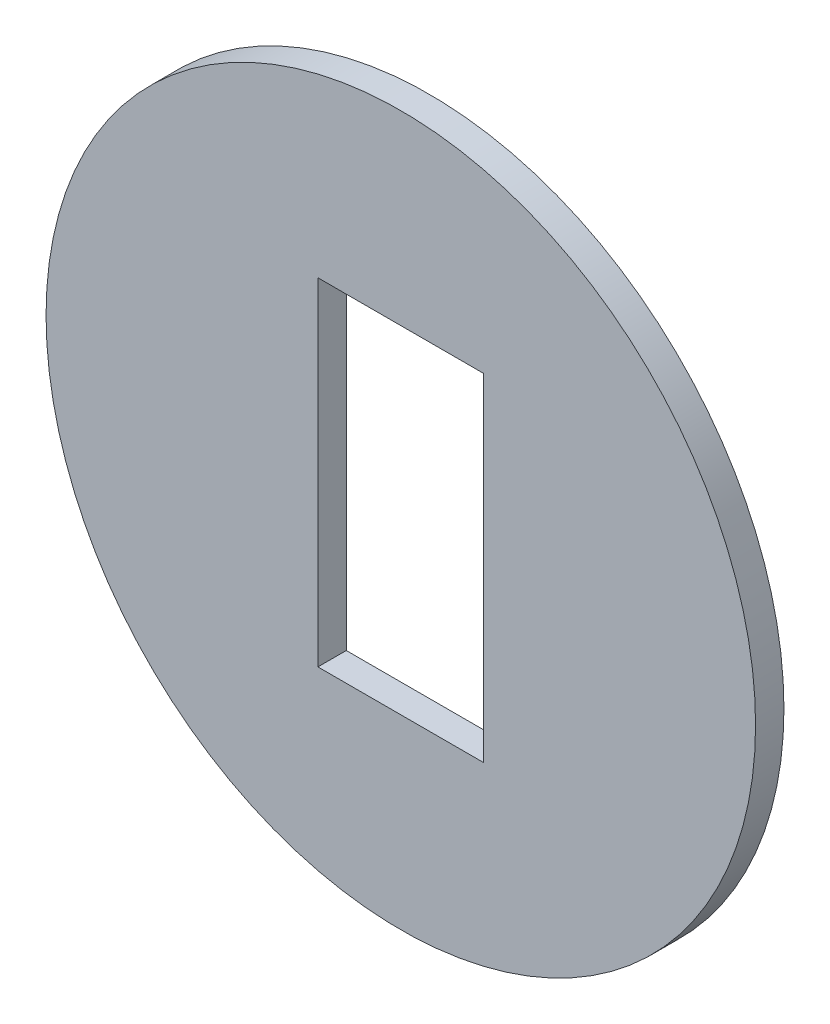
ISO-10303-21;
HEADER;
FILE_DESCRIPTION(('STEP AP214'),'2;1');
FILE_NAME('part.step','',(''),(''),'','','');
FILE_SCHEMA(('AUTOMOTIVE_DESIGN { 1 0 10303 214 1 1 1 1 }'));
ENDSEC;
DATA;
#1=APPLICATION_CONTEXT('core data for automotive mechanical design processes');
#2=APPLICATION_PROTOCOL_DEFINITION('international standard','automotive_design',2000,#1);
#3=PRODUCT_CONTEXT('',#1,'mechanical');
#4=PRODUCT('Part','Part','',(#3));
#5=PRODUCT_RELATED_PRODUCT_CATEGORY('part','',(#4));
#6=PRODUCT_DEFINITION_FORMATION('','',#4);
#7=PRODUCT_DEFINITION_CONTEXT('part definition',#1,'design');
#8=PRODUCT_DEFINITION('design','',#6,#7);
#9=PRODUCT_DEFINITION_SHAPE('','',#8);
#10=(LENGTH_UNIT() NAMED_UNIT(*) SI_UNIT(.MILLI.,.METRE.));
#11=(NAMED_UNIT(*) PLANE_ANGLE_UNIT() SI_UNIT($,.RADIAN.));
#12=(NAMED_UNIT(*) SI_UNIT($,.STERADIAN.) SOLID_ANGLE_UNIT());
#13=UNCERTAINTY_MEASURE_WITH_UNIT(LENGTH_MEASURE(1.E-05),#10,'distance_accuracy_value','');
#14=(GEOMETRIC_REPRESENTATION_CONTEXT(3) GLOBAL_UNCERTAINTY_ASSIGNED_CONTEXT((#13)) GLOBAL_UNIT_ASSIGNED_CONTEXT((#10,
#11,#12)) REPRESENTATION_CONTEXT('',''));
#15=CARTESIAN_POINT('',(0.,0.,0.));
#16=DIRECTION('',(0.,0.,1.));
#17=DIRECTION('',(1.,0.,0.));
#18=AXIS2_PLACEMENT_3D('',#15,#16,#17);
#19=CARTESIAN_POINT('',(0.,0.,2.));
#20=DIRECTION('',(0.,0.,-1.));
#21=DIRECTION('',(-1.,0.,0.));
#22=AXIS2_PLACEMENT_3D('',#19,#20,#21);
#23=CYLINDRICAL_SURFACE('',#22,25.);
#24=CARTESIAN_POINT('',(0.,0.,2.));
#25=DIRECTION('',(0.,0.,1.));
#26=DIRECTION('',(1.,0.,0.));
#27=AXIS2_PLACEMENT_3D('',#24,#25,#26);
#28=CIRCLE('',#27,25.);
#29=CARTESIAN_POINT('',(25.,0.,2.));
#30=VERTEX_POINT('',#29);
#31=EDGE_CURVE('E11',#30,#30,#28,.T.);
#32=ORIENTED_EDGE('',*,*,#31,.F.);
#33=EDGE_LOOP('',(#32));
#34=FACE_BOUND('',#33,.T.);
#35=CARTESIAN_POINT('',(0.,0.,0.));
#36=DIRECTION('',(0.,0.,1.));
#37=DIRECTION('',(1.,0.,0.));
#38=AXIS2_PLACEMENT_3D('',#35,#36,#37);
#39=CIRCLE('',#38,25.);
#40=CARTESIAN_POINT('',(25.,0.,0.));
#41=VERTEX_POINT('',#40);
#42=EDGE_CURVE('E36',#41,#41,#39,.T.);
#43=ORIENTED_EDGE('',*,*,#42,.T.);
#44=EDGE_LOOP('',(#43));
#45=FACE_BOUND('',#44,.T.);
#46=ADVANCED_FACE('F33',(#34,#45),#23,.T.);
#47=CARTESIAN_POINT('',(0.,0.,2.));
#48=DIRECTION('',(0.,0.,1.));
#49=DIRECTION('',(1.,0.,0.));
#50=AXIS2_PLACEMENT_3D('',#47,#48,#49);
#51=PLANE('',#50);
#52=DIRECTION('',(0.,-1.,0.));
#53=VECTOR('',#52,1.);
#54=CARTESIAN_POINT('',(-5.842,11.8745,2.));
#55=LINE('',#54,#53);
#56=CARTESIAN_POINT('',(-5.842,11.8745,2.));
#57=VERTEX_POINT('',#56);
#58=CARTESIAN_POINT('',(-5.842,-11.8745,2.));
#59=VERTEX_POINT('',#58);
#60=EDGE_CURVE('E47',#57,#59,#55,.T.);
#61=ORIENTED_EDGE('',*,*,#60,.F.);
#62=DIRECTION('',(-1.,0.,0.));
#63=VECTOR('',#62,1.);
#64=CARTESIAN_POINT('',(5.842,11.8745,2.));
#65=LINE('',#64,#63);
#66=CARTESIAN_POINT('',(5.842,11.8745,2.));
#67=VERTEX_POINT('',#66);
#68=EDGE_CURVE('E81',#67,#57,#65,.T.);
#69=ORIENTED_EDGE('',*,*,#68,.F.);
#70=DIRECTION('',(0.,1.,0.));
#71=VECTOR('',#70,1.);
#72=CARTESIAN_POINT('',(5.842,11.8745,2.));
#73=LINE('',#72,#71);
#74=CARTESIAN_POINT('',(5.842,-11.8745,2.));
#75=VERTEX_POINT('',#74);
#76=EDGE_CURVE('E100',#75,#67,#73,.T.);
#77=ORIENTED_EDGE('',*,*,#76,.F.);
#78=DIRECTION('',(1.,0.,0.));
#79=VECTOR('',#78,1.);
#80=CARTESIAN_POINT('',(5.842,-11.8745,2.));
#81=LINE('',#80,#79);
#82=EDGE_CURVE('E94',#59,#75,#81,.T.);
#83=ORIENTED_EDGE('',*,*,#82,.F.);
#84=EDGE_LOOP('',(#61,#69,#77,#83));
#85=FACE_BOUND('',#84,.T.);
#86=ORIENTED_EDGE('',*,*,#31,.T.);
#87=EDGE_LOOP('',(#86));
#88=FACE_BOUND('',#87,.T.);
#89=ADVANCED_FACE('F112',(#85,#88),#51,.T.);
#90=CARTESIAN_POINT('',(0.,0.,0.));
#91=DIRECTION('',(0.,0.,1.));
#92=DIRECTION('',(1.,0.,0.));
#93=AXIS2_PLACEMENT_3D('',#90,#91,#92);
#94=PLANE('',#93);
#95=DIRECTION('',(1.,0.,0.));
#96=VECTOR('',#95,1.);
#97=CARTESIAN_POINT('',(5.842,11.8745,0.));
#98=LINE('',#97,#96);
#99=CARTESIAN_POINT('',(-5.842,11.8745,0.));
#100=VERTEX_POINT('',#99);
#101=CARTESIAN_POINT('',(5.842,11.8745,0.));
#102=VERTEX_POINT('',#101);
#103=EDGE_CURVE('E92',#100,#102,#98,.T.);
#104=ORIENTED_EDGE('',*,*,#103,.F.);
#105=DIRECTION('',(0.,1.,0.));
#106=VECTOR('',#105,1.);
#107=CARTESIAN_POINT('',(-5.842,11.8745,0.));
#108=LINE('',#107,#106);
#109=CARTESIAN_POINT('',(-5.842,-11.8745,0.));
#110=VERTEX_POINT('',#109);
#111=EDGE_CURVE('E75',#110,#100,#108,.T.);
#112=ORIENTED_EDGE('',*,*,#111,.F.);
#113=DIRECTION('',(-1.,0.,0.));
#114=VECTOR('',#113,1.);
#115=CARTESIAN_POINT('',(5.842,-11.8745,0.));
#116=LINE('',#115,#114);
#117=CARTESIAN_POINT('',(5.842,-11.8745,0.));
#118=VERTEX_POINT('',#117);
#119=EDGE_CURVE('E84',#118,#110,#116,.T.);
#120=ORIENTED_EDGE('',*,*,#119,.F.);
#121=DIRECTION('',(0.,-1.,0.));
#122=VECTOR('',#121,1.);
#123=CARTESIAN_POINT('',(5.842,11.8745,0.));
#124=LINE('',#123,#122);
#125=EDGE_CURVE('E55',#102,#118,#124,.T.);
#126=ORIENTED_EDGE('',*,*,#125,.F.);
#127=EDGE_LOOP('',(#104,#112,#120,#126));
#128=FACE_BOUND('',#127,.T.);
#129=ORIENTED_EDGE('',*,*,#42,.F.);
#130=EDGE_LOOP('',(#129));
#131=FACE_BOUND('',#130,.T.);
#132=ADVANCED_FACE('F89',(#128,#131),#94,.F.);
#133=CARTESIAN_POINT('',(-5.842,11.8745,-0.00100000000000013));
#134=DIRECTION('',(-1.,0.,0.));
#135=DIRECTION('',(0.,-1.,0.));
#136=AXIS2_PLACEMENT_3D('',#133,#134,#135);
#137=PLANE('',#136);
#138=ORIENTED_EDGE('',*,*,#111,.T.);
#139=DIRECTION('',(0.,0.,1.));
#140=VECTOR('',#139,1.);
#141=CARTESIAN_POINT('',(-5.842,11.8745,-0.00100000000000013));
#142=LINE('',#141,#140);
#143=EDGE_CURVE('E87',#100,#57,#142,.T.);
#144=ORIENTED_EDGE('',*,*,#143,.T.);
#145=ORIENTED_EDGE('',*,*,#60,.T.);
#146=DIRECTION('',(0.,0.,1.));
#147=VECTOR('',#146,1.);
#148=CARTESIAN_POINT('',(-5.842,-11.8745,-0.00100000000000013));
#149=LINE('',#148,#147);
#150=EDGE_CURVE('E71',#110,#59,#149,.T.);
#151=ORIENTED_EDGE('',*,*,#150,.F.);
#152=EDGE_LOOP('',(#138,#144,#145,#151));
#153=FACE_BOUND('',#152,.T.);
#154=ADVANCED_FACE('F73',(#153),#137,.F.);
#155=CARTESIAN_POINT('',(5.842,11.8745,-0.00100000000000013));
#156=DIRECTION('',(0.,1.,0.));
#157=DIRECTION('',(0.,0.,1.));
#158=AXIS2_PLACEMENT_3D('',#155,#156,#157);
#159=PLANE('',#158);
#160=ORIENTED_EDGE('',*,*,#103,.T.);
#161=DIRECTION('',(0.,0.,1.));
#162=VECTOR('',#161,1.);
#163=CARTESIAN_POINT('',(5.842,11.8745,-0.00100000000000013));
#164=LINE('',#163,#162);
#165=EDGE_CURVE('E106',#102,#67,#164,.T.);
#166=ORIENTED_EDGE('',*,*,#165,.T.);
#167=ORIENTED_EDGE('',*,*,#68,.T.);
#168=ORIENTED_EDGE('',*,*,#143,.F.);
#169=EDGE_LOOP('',(#160,#166,#167,#168));
#170=FACE_BOUND('',#169,.T.);
#171=ADVANCED_FACE('F115',(#170),#159,.F.);
#172=CARTESIAN_POINT('',(5.842,11.8745,-0.00100000000000013));
#173=DIRECTION('',(1.,0.,0.));
#174=DIRECTION('',(0.,1.,0.));
#175=AXIS2_PLACEMENT_3D('',#172,#173,#174);
#176=PLANE('',#175);
#177=ORIENTED_EDGE('',*,*,#125,.T.);
#178=DIRECTION('',(0.,0.,1.));
#179=VECTOR('',#178,1.);
#180=CARTESIAN_POINT('',(5.842,-11.8745,-0.00100000000000013));
#181=LINE('',#180,#179);
#182=EDGE_CURVE('E80',#118,#75,#181,.T.);
#183=ORIENTED_EDGE('',*,*,#182,.T.);
#184=ORIENTED_EDGE('',*,*,#76,.T.);
#185=ORIENTED_EDGE('',*,*,#165,.F.);
#186=EDGE_LOOP('',(#177,#183,#184,#185));
#187=FACE_BOUND('',#186,.T.);
#188=ADVANCED_FACE('F108',(#187),#176,.F.);
#189=CARTESIAN_POINT('',(5.842,-11.8745,-0.00100000000000013));
#190=DIRECTION('',(0.,-1.,0.));
#191=DIRECTION('',(0.,0.,-1.));
#192=AXIS2_PLACEMENT_3D('',#189,#190,#191);
#193=PLANE('',#192);
#194=ORIENTED_EDGE('',*,*,#119,.T.);
#195=ORIENTED_EDGE('',*,*,#150,.T.);
#196=ORIENTED_EDGE('',*,*,#82,.T.);
#197=ORIENTED_EDGE('',*,*,#182,.F.);
#198=EDGE_LOOP('',(#194,#195,#196,#197));
#199=FACE_BOUND('',#198,.T.);
#200=ADVANCED_FACE('F85',(#199),#193,.F.);
#201=CLOSED_SHELL('',(#46,#89,#132,#154,#171,#188,#200));
#202=MANIFOLD_SOLID_BREP('B2',#201);
#203=ADVANCED_BREP_SHAPE_REPRESENTATION('',(#18,#202),#14);
#204=SHAPE_DEFINITION_REPRESENTATION(#9,#203);
ENDSEC;
END-ISO-10303-21;
